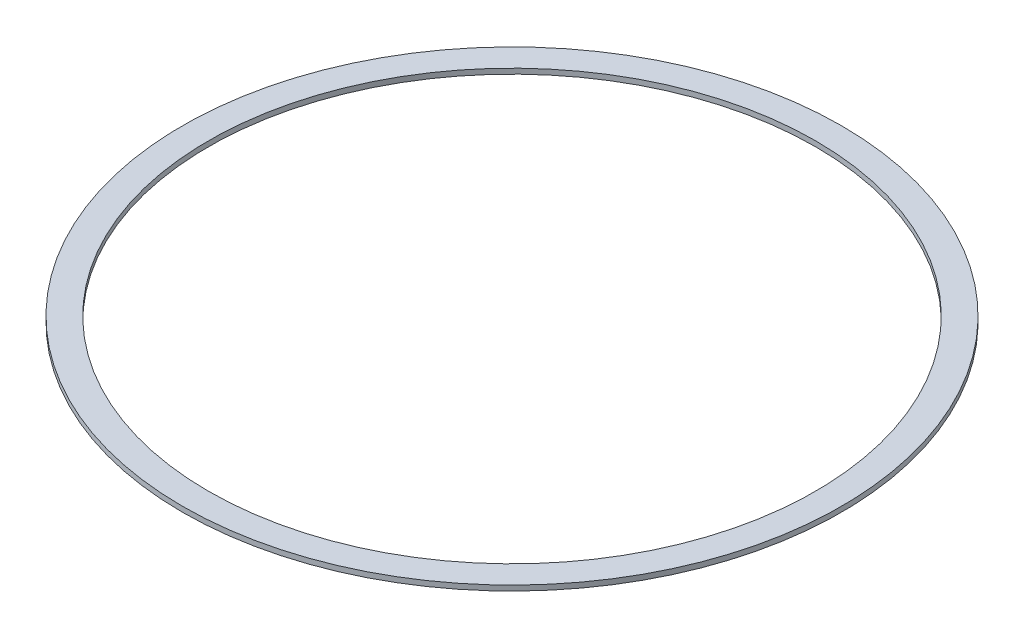
ISO-10303-21;
HEADER;
FILE_DESCRIPTION(('STEP AP214'),'2;1');
FILE_NAME('part.step','',(''),(''),'','','');
FILE_SCHEMA(('AUTOMOTIVE_DESIGN { 1 0 10303 214 1 1 1 1 }'));
ENDSEC;
DATA;
#1=APPLICATION_CONTEXT('core data for automotive mechanical design processes');
#2=APPLICATION_PROTOCOL_DEFINITION('international standard','automotive_design',2000,#1);
#3=PRODUCT_CONTEXT('',#1,'mechanical');
#4=PRODUCT('Part','Part','',(#3));
#5=PRODUCT_RELATED_PRODUCT_CATEGORY('part','',(#4));
#6=PRODUCT_DEFINITION_FORMATION('','',#4);
#7=PRODUCT_DEFINITION_CONTEXT('part definition',#1,'design');
#8=PRODUCT_DEFINITION('design','',#6,#7);
#9=PRODUCT_DEFINITION_SHAPE('','',#8);
#10=(LENGTH_UNIT() NAMED_UNIT(*) SI_UNIT(.MILLI.,.METRE.));
#11=(NAMED_UNIT(*) PLANE_ANGLE_UNIT() SI_UNIT($,.RADIAN.));
#12=(NAMED_UNIT(*) SI_UNIT($,.STERADIAN.) SOLID_ANGLE_UNIT());
#13=UNCERTAINTY_MEASURE_WITH_UNIT(LENGTH_MEASURE(1.E-05),#10,'distance_accuracy_value','');
#14=(GEOMETRIC_REPRESENTATION_CONTEXT(3) GLOBAL_UNCERTAINTY_ASSIGNED_CONTEXT((#13)) GLOBAL_UNIT_ASSIGNED_CONTEXT((#10,
#11,#12)) REPRESENTATION_CONTEXT('',''));
#15=CARTESIAN_POINT('',(0.,0.,0.));
#16=DIRECTION('',(0.,0.,1.));
#17=DIRECTION('',(1.,0.,0.));
#18=AXIS2_PLACEMENT_3D('',#15,#16,#17);
#19=CARTESIAN_POINT('',(0.,1.5,0.));
#20=DIRECTION('',(0.,1.,0.));
#21=DIRECTION('',(0.,0.,1.));
#22=AXIS2_PLACEMENT_3D('',#19,#20,#21);
#23=PLANE('',#22);
#24=CARTESIAN_POINT('',(0.,1.5,0.));
#25=DIRECTION('',(0.,1.,0.));
#26=DIRECTION('',(0.,0.,1.));
#27=AXIS2_PLACEMENT_3D('',#24,#25,#26);
#28=CIRCLE('',#27,190.);
#29=CARTESIAN_POINT('',(0.,1.5,190.));
#30=VERTEX_POINT('',#29);
#31=EDGE_CURVE('E10',#30,#30,#28,.T.);
#32=ORIENTED_EDGE('',*,*,#31,.T.);
#33=EDGE_LOOP('',(#32));
#34=FACE_BOUND('',#33,.T.);
#35=CARTESIAN_POINT('',(0.,1.5,0.));
#36=DIRECTION('',(0.,1.,0.));
#37=DIRECTION('',(0.,0.,1.));
#38=AXIS2_PLACEMENT_3D('',#35,#36,#37);
#39=CIRCLE('',#38,175.);
#40=CARTESIAN_POINT('',(0.,1.5,175.));
#41=VERTEX_POINT('',#40);
#42=EDGE_CURVE('E42',#41,#41,#39,.T.);
#43=ORIENTED_EDGE('',*,*,#42,.F.);
#44=EDGE_LOOP('',(#43));
#45=FACE_BOUND('',#44,.T.);
#46=ADVANCED_FACE('F31',(#34,#45),#23,.T.);
#47=CARTESIAN_POINT('',(0.,-1.5,0.));
#48=DIRECTION('',(0.,1.,0.));
#49=DIRECTION('',(0.,0.,1.));
#50=AXIS2_PLACEMENT_3D('',#47,#48,#49);
#51=PLANE('',#50);
#52=CARTESIAN_POINT('',(0.,-1.5,0.));
#53=DIRECTION('',(0.,1.,0.));
#54=DIRECTION('',(0.,0.,1.));
#55=AXIS2_PLACEMENT_3D('',#52,#53,#54);
#56=CIRCLE('',#55,190.);
#57=CARTESIAN_POINT('',(0.,-1.5,190.));
#58=VERTEX_POINT('',#57);
#59=EDGE_CURVE('E35',#58,#58,#56,.T.);
#60=ORIENTED_EDGE('',*,*,#59,.F.);
#61=EDGE_LOOP('',(#60));
#62=FACE_BOUND('',#61,.T.);
#63=CARTESIAN_POINT('',(0.,-1.5,0.));
#64=DIRECTION('',(0.,1.,0.));
#65=DIRECTION('',(0.,0.,1.));
#66=AXIS2_PLACEMENT_3D('',#63,#64,#65);
#67=CIRCLE('',#66,175.);
#68=CARTESIAN_POINT('',(0.,-1.5,175.));
#69=VERTEX_POINT('',#68);
#70=EDGE_CURVE('E44',#69,#69,#67,.T.);
#71=ORIENTED_EDGE('',*,*,#70,.T.);
#72=EDGE_LOOP('',(#71));
#73=FACE_BOUND('',#72,.T.);
#74=ADVANCED_FACE('F54',(#62,#73),#51,.F.);
#75=CARTESIAN_POINT('',(0.,1.5,0.));
#76=DIRECTION('',(0.,-1.,0.));
#77=DIRECTION('',(0.,0.,-1.));
#78=AXIS2_PLACEMENT_3D('',#75,#76,#77);
#79=CYLINDRICAL_SURFACE('',#78,190.);
#80=ORIENTED_EDGE('',*,*,#31,.F.);
#81=EDGE_LOOP('',(#80));
#82=FACE_BOUND('',#81,.T.);
#83=ORIENTED_EDGE('',*,*,#59,.T.);
#84=EDGE_LOOP('',(#83));
#85=FACE_BOUND('',#84,.T.);
#86=ADVANCED_FACE('F33',(#82,#85),#79,.T.);
#87=CARTESIAN_POINT('',(0.,1.5,0.));
#88=DIRECTION('',(0.,-1.,0.));
#89=DIRECTION('',(0.,0.,-1.));
#90=AXIS2_PLACEMENT_3D('',#87,#88,#89);
#91=CYLINDRICAL_SURFACE('',#90,175.);
#92=ORIENTED_EDGE('',*,*,#42,.T.);
#93=EDGE_LOOP('',(#92));
#94=FACE_BOUND('',#93,.T.);
#95=ORIENTED_EDGE('',*,*,#70,.F.);
#96=EDGE_LOOP('',(#95));
#97=FACE_BOUND('',#96,.T.);
#98=ADVANCED_FACE('F50',(#94,#97),#91,.F.);
#99=CLOSED_SHELL('',(#46,#74,#86,#98));
#100=MANIFOLD_SOLID_BREP('B2',#99);
#101=ADVANCED_BREP_SHAPE_REPRESENTATION('',(#18,#100),#14);
#102=SHAPE_DEFINITION_REPRESENTATION(#9,#101);
ENDSEC;
END-ISO-10303-21;
